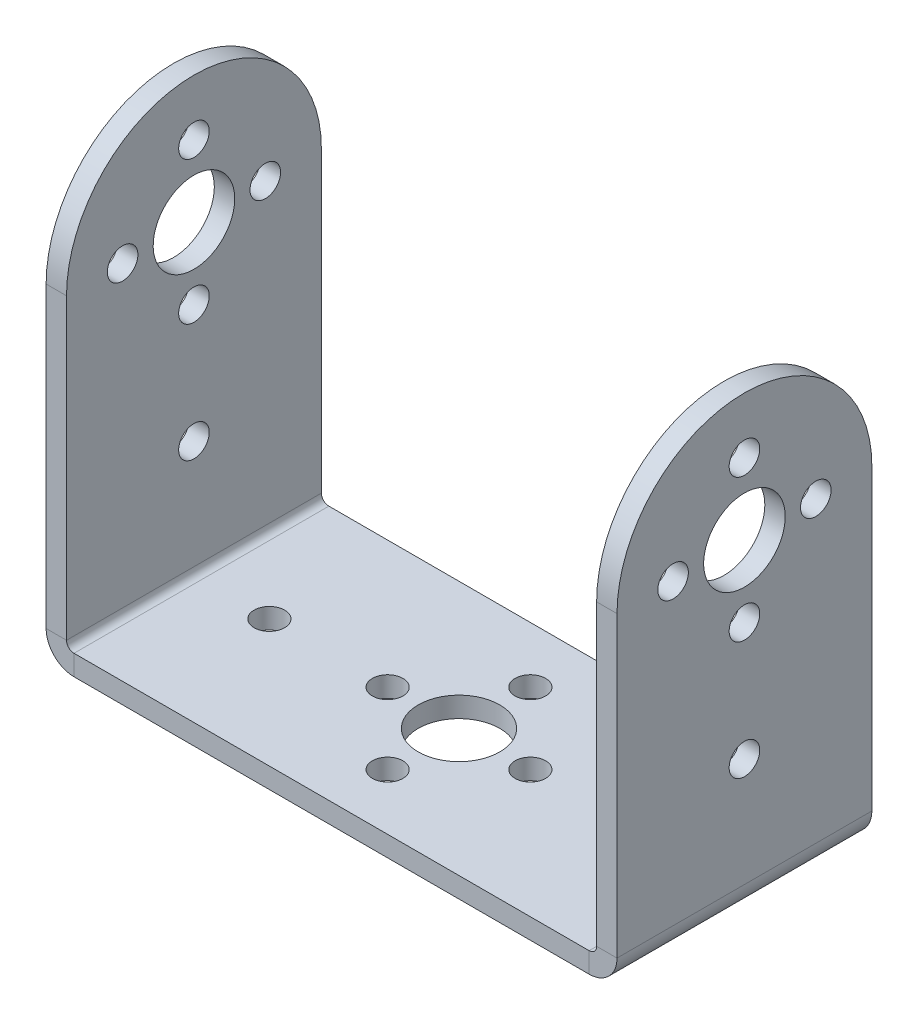
ISO-10303-21;
HEADER;
FILE_DESCRIPTION(('STEP AP214'),'2;1');
FILE_NAME('part.step','',(''),(''),'','','');
FILE_SCHEMA(('AUTOMOTIVE_DESIGN { 1 0 10303 214 1 1 1 1 }'));
ENDSEC;
DATA;
#1=APPLICATION_CONTEXT('core data for automotive mechanical design processes');
#2=APPLICATION_PROTOCOL_DEFINITION('international standard','automotive_design',2000,#1);
#3=PRODUCT_CONTEXT('',#1,'mechanical');
#4=PRODUCT('Part','Part','',(#3));
#5=PRODUCT_RELATED_PRODUCT_CATEGORY('part','',(#4));
#6=PRODUCT_DEFINITION_FORMATION('','',#4);
#7=PRODUCT_DEFINITION_CONTEXT('part definition',#1,'design');
#8=PRODUCT_DEFINITION('design','',#6,#7);
#9=PRODUCT_DEFINITION_SHAPE('','',#8);
#10=(LENGTH_UNIT() NAMED_UNIT(*) SI_UNIT(.MILLI.,.METRE.));
#11=(NAMED_UNIT(*) PLANE_ANGLE_UNIT() SI_UNIT($,.RADIAN.));
#12=(NAMED_UNIT(*) SI_UNIT($,.STERADIAN.) SOLID_ANGLE_UNIT());
#13=UNCERTAINTY_MEASURE_WITH_UNIT(LENGTH_MEASURE(1.E-05),#10,'distance_accuracy_value','');
#14=(GEOMETRIC_REPRESENTATION_CONTEXT(3) GLOBAL_UNCERTAINTY_ASSIGNED_CONTEXT((#13)) GLOBAL_UNIT_ASSIGNED_CONTEXT((#10,
#11,#12)) REPRESENTATION_CONTEXT('',''));
#15=CARTESIAN_POINT('',(0.,0.,0.));
#16=DIRECTION('',(0.,0.,1.));
#17=DIRECTION('',(1.,0.,0.));
#18=AXIS2_PLACEMENT_3D('',#15,#16,#17);
#19=CARTESIAN_POINT('',(0.,0.,0.));
#20=DIRECTION('',(0.,1.,0.));
#21=DIRECTION('',(0.,0.,1.));
#22=AXIS2_PLACEMENT_3D('',#19,#20,#21);
#23=PLANE('',#22);
#24=CARTESIAN_POINT('',(18.6,0.,0.));
#25=DIRECTION('',(0.,1.,0.));
#26=DIRECTION('',(0.,0.,1.));
#27=AXIS2_PLACEMENT_3D('',#24,#25,#26);
#28=CIRCLE('',#27,1.49999999999999);
#29=CARTESIAN_POINT('',(18.6,0.,1.49999999999999));
#30=VERTEX_POINT('',#29);
#31=EDGE_CURVE('E330',#30,#30,#28,.F.);
#32=ORIENTED_EDGE('',*,*,#31,.T.);
#33=EDGE_LOOP('',(#32));
#34=FACE_BOUND('',#33,.T.);
#35=DIRECTION('',(-1.,0.,0.));
#36=VECTOR('',#35,1.);
#37=CARTESIAN_POINT('',(-26.,0.,-12.5));
#38=LINE('',#37,#36);
#39=CARTESIAN_POINT('',(25.2634,0.,-12.5));
#40=VERTEX_POINT('',#39);
#41=CARTESIAN_POINT('',(-25.2634,0.,-12.5));
#42=VERTEX_POINT('',#41);
#43=EDGE_CURVE('E242',#40,#42,#38,.T.);
#44=ORIENTED_EDGE('',*,*,#43,.T.);
#45=DIRECTION('',(0.,0.,1.));
#46=VECTOR('',#45,1.);
#47=CARTESIAN_POINT('',(-25.2634,0.,12.5));
#48=LINE('',#47,#46);
#49=CARTESIAN_POINT('',(-25.2634,0.,12.5));
#50=VERTEX_POINT('',#49);
#51=EDGE_CURVE('E185',#50,#42,#48,.F.);
#52=ORIENTED_EDGE('',*,*,#51,.F.);
#53=DIRECTION('',(1.,0.,0.));
#54=VECTOR('',#53,1.);
#55=CARTESIAN_POINT('',(-26.,0.,12.5));
#56=LINE('',#55,#54);
#57=CARTESIAN_POINT('',(25.2634,0.,12.5));
#58=VERTEX_POINT('',#57);
#59=EDGE_CURVE('E246',#50,#58,#56,.T.);
#60=ORIENTED_EDGE('',*,*,#59,.T.);
#61=DIRECTION('',(0.,0.,-1.));
#62=VECTOR('',#61,1.);
#63=CARTESIAN_POINT('',(25.2634,0.,-12.5));
#64=LINE('',#63,#62);
#65=EDGE_CURVE('E53',#40,#58,#64,.F.);
#66=ORIENTED_EDGE('',*,*,#65,.F.);
#67=EDGE_LOOP('',(#44,#52,#60,#66));
#68=FACE_BOUND('',#67,.T.);
#69=CARTESIAN_POINT('',(-18.6,0.,0.));
#70=DIRECTION('',(0.,1.,0.));
#71=DIRECTION('',(0.,0.,1.));
#72=AXIS2_PLACEMENT_3D('',#69,#70,#71);
#73=CIRCLE('',#72,1.49999999999999);
#74=CARTESIAN_POINT('',(-18.6,0.,1.49999999999999));
#75=VERTEX_POINT('',#74);
#76=EDGE_CURVE('E324',#75,#75,#73,.F.);
#77=ORIENTED_EDGE('',*,*,#76,.T.);
#78=EDGE_LOOP('',(#77));
#79=FACE_BOUND('',#78,.T.);
#80=CARTESIAN_POINT('',(-7.,0.,0.));
#81=DIRECTION('',(0.,1.,0.));
#82=DIRECTION('',(0.,0.,1.));
#83=AXIS2_PLACEMENT_3D('',#80,#81,#82);
#84=CIRCLE('',#83,1.49999999999999);
#85=CARTESIAN_POINT('',(-7.,0.,1.49999999999999));
#86=VERTEX_POINT('',#85);
#87=EDGE_CURVE('E318',#86,#86,#84,.F.);
#88=ORIENTED_EDGE('',*,*,#87,.T.);
#89=EDGE_LOOP('',(#88));
#90=FACE_BOUND('',#89,.T.);
#91=CARTESIAN_POINT('',(7.,0.,0.));
#92=DIRECTION('',(0.,1.,0.));
#93=DIRECTION('',(0.,0.,1.));
#94=AXIS2_PLACEMENT_3D('',#91,#92,#93);
#95=CIRCLE('',#94,1.49999999999999);
#96=CARTESIAN_POINT('',(7.,0.,1.49999999999999));
#97=VERTEX_POINT('',#96);
#98=EDGE_CURVE('E312',#97,#97,#95,.F.);
#99=ORIENTED_EDGE('',*,*,#98,.T.);
#100=EDGE_LOOP('',(#99));
#101=FACE_BOUND('',#100,.T.);
#102=CARTESIAN_POINT('',(0.,0.,-7.));
#103=DIRECTION('',(0.,1.,0.));
#104=DIRECTION('',(0.,0.,1.));
#105=AXIS2_PLACEMENT_3D('',#102,#103,#104);
#106=CIRCLE('',#105,1.49999999999999);
#107=CARTESIAN_POINT('',(0.,0.,-5.50000000000001));
#108=VERTEX_POINT('',#107);
#109=EDGE_CURVE('E306',#108,#108,#106,.F.);
#110=ORIENTED_EDGE('',*,*,#109,.T.);
#111=EDGE_LOOP('',(#110));
#112=FACE_BOUND('',#111,.T.);
#113=CARTESIAN_POINT('',(0.,0.,7.));
#114=DIRECTION('',(0.,1.,0.));
#115=DIRECTION('',(0.,0.,1.));
#116=AXIS2_PLACEMENT_3D('',#113,#114,#115);
#117=CIRCLE('',#116,1.49999999999999);
#118=CARTESIAN_POINT('',(0.,0.,8.49999999999999));
#119=VERTEX_POINT('',#118);
#120=EDGE_CURVE('E300',#119,#119,#117,.F.);
#121=ORIENTED_EDGE('',*,*,#120,.T.);
#122=EDGE_LOOP('',(#121));
#123=FACE_BOUND('',#122,.T.);
#124=CARTESIAN_POINT('',(0.,0.,0.));
#125=DIRECTION('',(0.,1.,0.));
#126=DIRECTION('',(0.,0.,1.));
#127=AXIS2_PLACEMENT_3D('',#124,#125,#126);
#128=CIRCLE('',#127,4.);
#129=CARTESIAN_POINT('',(0.,0.,4.));
#130=VERTEX_POINT('',#129);
#131=EDGE_CURVE('E294',#130,#130,#128,.F.);
#132=ORIENTED_EDGE('',*,*,#131,.T.);
#133=EDGE_LOOP('',(#132));
#134=FACE_BOUND('',#133,.T.);
#135=ADVANCED_FACE('F36',(#34,#68,#79,#90,#101,#112,#123,#134),#23,.T.);
#136=CARTESIAN_POINT('',(0.,-2.,0.));
#137=DIRECTION('',(0.,1.,0.));
#138=DIRECTION('',(0.,0.,1.));
#139=AXIS2_PLACEMENT_3D('',#136,#137,#138);
#140=PLANE('',#139);
#141=CARTESIAN_POINT('',(0.,-2.,7.));
#142=DIRECTION('',(0.,-1.,0.));
#143=DIRECTION('',(0.,0.,-1.));
#144=AXIS2_PLACEMENT_3D('',#141,#142,#143);
#145=CIRCLE('',#144,1.49999999999999);
#146=CARTESIAN_POINT('',(0.,-2.,5.50000000000001));
#147=VERTEX_POINT('',#146);
#148=EDGE_CURVE('E297',#147,#147,#145,.T.);
#149=ORIENTED_EDGE('',*,*,#148,.F.);
#150=EDGE_LOOP('',(#149));
#151=FACE_BOUND('',#150,.T.);
#152=CARTESIAN_POINT('',(0.,-2.,-7.));
#153=DIRECTION('',(0.,-1.,0.));
#154=DIRECTION('',(0.,0.,-1.));
#155=AXIS2_PLACEMENT_3D('',#152,#153,#154);
#156=CIRCLE('',#155,1.49999999999999);
#157=CARTESIAN_POINT('',(0.,-2.,-8.49999999999999));
#158=VERTEX_POINT('',#157);
#159=EDGE_CURVE('E303',#158,#158,#156,.T.);
#160=ORIENTED_EDGE('',*,*,#159,.F.);
#161=EDGE_LOOP('',(#160));
#162=FACE_BOUND('',#161,.T.);
#163=CARTESIAN_POINT('',(7.,-2.,0.));
#164=DIRECTION('',(0.,-1.,0.));
#165=DIRECTION('',(0.,0.,-1.));
#166=AXIS2_PLACEMENT_3D('',#163,#164,#165);
#167=CIRCLE('',#166,1.49999999999999);
#168=CARTESIAN_POINT('',(7.,-2.,-1.49999999999999));
#169=VERTEX_POINT('',#168);
#170=EDGE_CURVE('E309',#169,#169,#167,.T.);
#171=ORIENTED_EDGE('',*,*,#170,.F.);
#172=EDGE_LOOP('',(#171));
#173=FACE_BOUND('',#172,.T.);
#174=CARTESIAN_POINT('',(-7.,-2.,0.));
#175=DIRECTION('',(0.,-1.,0.));
#176=DIRECTION('',(0.,0.,-1.));
#177=AXIS2_PLACEMENT_3D('',#174,#175,#176);
#178=CIRCLE('',#177,1.49999999999999);
#179=CARTESIAN_POINT('',(-7.,-2.,-1.49999999999999));
#180=VERTEX_POINT('',#179);
#181=EDGE_CURVE('E315',#180,#180,#178,.T.);
#182=ORIENTED_EDGE('',*,*,#181,.F.);
#183=EDGE_LOOP('',(#182));
#184=FACE_BOUND('',#183,.T.);
#185=CARTESIAN_POINT('',(-18.6,-2.,0.));
#186=DIRECTION('',(0.,-1.,0.));
#187=DIRECTION('',(0.,0.,-1.));
#188=AXIS2_PLACEMENT_3D('',#185,#186,#187);
#189=CIRCLE('',#188,1.49999999999999);
#190=CARTESIAN_POINT('',(-18.6,-2.,-1.49999999999999));
#191=VERTEX_POINT('',#190);
#192=EDGE_CURVE('E321',#191,#191,#189,.T.);
#193=ORIENTED_EDGE('',*,*,#192,.F.);
#194=EDGE_LOOP('',(#193));
#195=FACE_BOUND('',#194,.T.);
#196=CARTESIAN_POINT('',(18.6,-2.,0.));
#197=DIRECTION('',(0.,-1.,0.));
#198=DIRECTION('',(0.,0.,-1.));
#199=AXIS2_PLACEMENT_3D('',#196,#197,#198);
#200=CIRCLE('',#199,1.49999999999999);
#201=CARTESIAN_POINT('',(18.6,-2.,-1.49999999999999));
#202=VERTEX_POINT('',#201);
#203=EDGE_CURVE('E327',#202,#202,#200,.T.);
#204=ORIENTED_EDGE('',*,*,#203,.F.);
#205=EDGE_LOOP('',(#204));
#206=FACE_BOUND('',#205,.T.);
#207=DIRECTION('',(0.,0.,1.));
#208=VECTOR('',#207,1.);
#209=CARTESIAN_POINT('',(-25.2634,-2.,12.5));
#210=LINE('',#209,#208);
#211=CARTESIAN_POINT('',(-25.2634,-2.,12.5));
#212=VERTEX_POINT('',#211);
#213=CARTESIAN_POINT('',(-25.2634,-2.,-12.5));
#214=VERTEX_POINT('',#213);
#215=EDGE_CURVE('E134',#212,#214,#210,.F.);
#216=ORIENTED_EDGE('',*,*,#215,.T.);
#217=DIRECTION('',(-1.,0.,0.));
#218=VECTOR('',#217,1.);
#219=CARTESIAN_POINT('',(-26.,-2.,-12.5));
#220=LINE('',#219,#218);
#221=CARTESIAN_POINT('',(25.2634,-2.,-12.5));
#222=VERTEX_POINT('',#221);
#223=EDGE_CURVE('E45',#222,#214,#220,.T.);
#224=ORIENTED_EDGE('',*,*,#223,.F.);
#225=DIRECTION('',(0.,0.,-1.));
#226=VECTOR('',#225,1.);
#227=CARTESIAN_POINT('',(25.2634,-2.,-12.5));
#228=LINE('',#227,#226);
#229=CARTESIAN_POINT('',(25.2634,-2.,12.5));
#230=VERTEX_POINT('',#229);
#231=EDGE_CURVE('E224',#222,#230,#228,.F.);
#232=ORIENTED_EDGE('',*,*,#231,.T.);
#233=DIRECTION('',(1.,0.,0.));
#234=VECTOR('',#233,1.);
#235=CARTESIAN_POINT('',(-26.,-2.,12.5));
#236=LINE('',#235,#234);
#237=EDGE_CURVE('E11',#212,#230,#236,.T.);
#238=ORIENTED_EDGE('',*,*,#237,.F.);
#239=EDGE_LOOP('',(#216,#224,#232,#238));
#240=FACE_BOUND('',#239,.T.);
#241=CARTESIAN_POINT('',(0.,-2.,0.));
#242=DIRECTION('',(0.,-1.,0.));
#243=DIRECTION('',(0.,0.,-1.));
#244=AXIS2_PLACEMENT_3D('',#241,#242,#243);
#245=CIRCLE('',#244,4.);
#246=CARTESIAN_POINT('',(0.,-2.,-4.));
#247=VERTEX_POINT('',#246);
#248=EDGE_CURVE('E291',#247,#247,#245,.T.);
#249=ORIENTED_EDGE('',*,*,#248,.F.);
#250=EDGE_LOOP('',(#249));
#251=FACE_BOUND('',#250,.T.);
#252=ADVANCED_FACE('F367',(#151,#162,#173,#184,#195,#206,#240,#251),#140,.F.);
#253=CARTESIAN_POINT('',(-26.,-2.,12.5));
#254=DIRECTION('',(0.,0.,1.));
#255=DIRECTION('',(1.,0.,0.));
#256=AXIS2_PLACEMENT_3D('',#253,#254,#255);
#257=PLANE('',#256);
#258=ORIENTED_EDGE('',*,*,#59,.F.);
#259=DIRECTION('',(0.,-1.,0.));
#260=VECTOR('',#259,1.);
#261=CARTESIAN_POINT('',(-25.2634,0.,12.5));
#262=LINE('',#261,#260);
#263=EDGE_CURVE('E181',#50,#212,#262,.T.);
#264=ORIENTED_EDGE('',*,*,#263,.T.);
#265=ORIENTED_EDGE('',*,*,#237,.T.);
#266=DIRECTION('',(0.,-1.,0.));
#267=VECTOR('',#266,1.);
#268=CARTESIAN_POINT('',(25.2634,0.,12.5));
#269=LINE('',#268,#267);
#270=EDGE_CURVE('E239',#58,#230,#269,.T.);
#271=ORIENTED_EDGE('',*,*,#270,.F.);
#272=EDGE_LOOP('',(#258,#264,#265,#271));
#273=FACE_BOUND('',#272,.T.);
#274=ADVANCED_FACE('F374',(#273),#257,.T.);
#275=CARTESIAN_POINT('',(-26.,-2.,-12.5));
#276=DIRECTION('',(0.,0.,-1.));
#277=DIRECTION('',(-1.,0.,0.));
#278=AXIS2_PLACEMENT_3D('',#275,#276,#277);
#279=PLANE('',#278);
#280=DIRECTION('',(0.,-1.,0.));
#281=VECTOR('',#280,1.);
#282=CARTESIAN_POINT('',(-25.2634,0.,-12.5));
#283=LINE('',#282,#281);
#284=EDGE_CURVE('E189',#42,#214,#283,.T.);
#285=ORIENTED_EDGE('',*,*,#284,.F.);
#286=ORIENTED_EDGE('',*,*,#43,.F.);
#287=DIRECTION('',(0.,-1.,0.));
#288=VECTOR('',#287,1.);
#289=CARTESIAN_POINT('',(25.2634,0.,-12.5));
#290=LINE('',#289,#288);
#291=EDGE_CURVE('E230',#40,#222,#290,.T.);
#292=ORIENTED_EDGE('',*,*,#291,.T.);
#293=ORIENTED_EDGE('',*,*,#223,.T.);
#294=EDGE_LOOP('',(#285,#286,#292,#293));
#295=FACE_BOUND('',#294,.T.);
#296=ADVANCED_FACE('F38',(#295),#279,.T.);
#297=CARTESIAN_POINT('',(25.2634,0.7366,12.5));
#298=DIRECTION('',(0.,0.,1.));
#299=DIRECTION('',(1.,0.,0.));
#300=AXIS2_PLACEMENT_3D('',#297,#298,#299);
#301=PLANE('',#300);
#302=DIRECTION('',(1.,0.,0.));
#303=VECTOR('',#302,1.);
#304=CARTESIAN_POINT('',(26.,0.736599999999997,12.5));
#305=LINE('',#304,#303);
#306=CARTESIAN_POINT('',(26.,0.736599999999997,12.5));
#307=VERTEX_POINT('',#306);
#308=CARTESIAN_POINT('',(28.,0.73659999999999,12.5));
#309=VERTEX_POINT('',#308);
#310=EDGE_CURVE('E192',#307,#309,#305,.T.);
#311=ORIENTED_EDGE('',*,*,#310,.F.);
#312=CARTESIAN_POINT('',(25.2634,0.7366,12.5));
#313=DIRECTION('',(0.,0.,-1.));
#314=DIRECTION('',(-1.,0.,0.));
#315=AXIS2_PLACEMENT_3D('',#312,#313,#314);
#316=CIRCLE('',#315,0.7366);
#317=EDGE_CURVE('E233',#58,#307,#316,.F.);
#318=ORIENTED_EDGE('',*,*,#317,.F.);
#319=ORIENTED_EDGE('',*,*,#270,.T.);
#320=CARTESIAN_POINT('',(25.2634,0.7366,12.5));
#321=DIRECTION('',(0.,0.,-1.));
#322=DIRECTION('',(-1.,0.,0.));
#323=AXIS2_PLACEMENT_3D('',#320,#321,#322);
#324=CIRCLE('',#323,2.7366);
#325=EDGE_CURVE('E226',#230,#309,#324,.F.);
#326=ORIENTED_EDGE('',*,*,#325,.T.);
#327=EDGE_LOOP('',(#311,#318,#319,#326));
#328=FACE_BOUND('',#327,.T.);
#329=ADVANCED_FACE('F382',(#328),#301,.T.);
#330=CARTESIAN_POINT('',(25.2634,0.7366,-12.5));
#331=DIRECTION('',(0.,0.,1.));
#332=DIRECTION('',(1.,0.,0.));
#333=AXIS2_PLACEMENT_3D('',#330,#331,#332);
#334=PLANE('',#333);
#335=CARTESIAN_POINT('',(25.2634,0.7366,-12.5));
#336=DIRECTION('',(0.,0.,-1.));
#337=DIRECTION('',(-1.,0.,0.));
#338=AXIS2_PLACEMENT_3D('',#335,#336,#337);
#339=CIRCLE('',#338,0.7366);
#340=CARTESIAN_POINT('',(26.,0.736599999999997,-12.5));
#341=VERTEX_POINT('',#340);
#342=EDGE_CURVE('E223',#341,#40,#339,.T.);
#343=ORIENTED_EDGE('',*,*,#342,.F.);
#344=DIRECTION('',(1.,0.,0.));
#345=VECTOR('',#344,1.);
#346=CARTESIAN_POINT('',(26.,0.736599999999997,-12.5));
#347=LINE('',#346,#345);
#348=CARTESIAN_POINT('',(28.,0.73659999999999,-12.5));
#349=VERTEX_POINT('',#348);
#350=EDGE_CURVE('E196',#341,#349,#347,.T.);
#351=ORIENTED_EDGE('',*,*,#350,.T.);
#352=CARTESIAN_POINT('',(25.2634,0.7366,-12.5));
#353=DIRECTION('',(0.,0.,-1.));
#354=DIRECTION('',(-1.,0.,0.));
#355=AXIS2_PLACEMENT_3D('',#352,#353,#354);
#356=CIRCLE('',#355,2.7366);
#357=EDGE_CURVE('E227',#349,#222,#356,.T.);
#358=ORIENTED_EDGE('',*,*,#357,.T.);
#359=ORIENTED_EDGE('',*,*,#291,.F.);
#360=EDGE_LOOP('',(#343,#351,#358,#359));
#361=FACE_BOUND('',#360,.T.);
#362=ADVANCED_FACE('F390',(#361),#334,.F.);
#363=CARTESIAN_POINT('',(25.2634,0.7366,-12.5));
#364=DIRECTION('',(0.,0.,-1.));
#365=DIRECTION('',(1.,0.,0.));
#366=AXIS2_PLACEMENT_3D('',#363,#364,#365);
#367=CYLINDRICAL_SURFACE('',#366,2.7366);
#368=ORIENTED_EDGE('',*,*,#231,.F.);
#369=ORIENTED_EDGE('',*,*,#357,.F.);
#370=DIRECTION('',(0.,0.,1.));
#371=VECTOR('',#370,1.);
#372=CARTESIAN_POINT('',(28.,0.73659999999999,0.));
#373=LINE('',#372,#371);
#374=EDGE_CURVE('E199',#349,#309,#373,.T.);
#375=ORIENTED_EDGE('',*,*,#374,.T.);
#376=ORIENTED_EDGE('',*,*,#325,.F.);
#377=EDGE_LOOP('',(#368,#369,#375,#376));
#378=FACE_BOUND('',#377,.T.);
#379=ADVANCED_FACE('F417',(#378),#367,.T.);
#380=CARTESIAN_POINT('',(25.2634,0.7366,-12.5));
#381=DIRECTION('',(0.,0.,-1.));
#382=DIRECTION('',(1.,0.,0.));
#383=AXIS2_PLACEMENT_3D('',#380,#381,#382);
#384=CYLINDRICAL_SURFACE('',#383,0.7366);
#385=ORIENTED_EDGE('',*,*,#65,.T.);
#386=ORIENTED_EDGE('',*,*,#317,.T.);
#387=DIRECTION('',(0.,0.,-1.));
#388=VECTOR('',#387,1.);
#389=CARTESIAN_POINT('',(26.,0.736599999999997,12.5));
#390=LINE('',#389,#388);
#391=EDGE_CURVE('E194',#307,#341,#390,.T.);
#392=ORIENTED_EDGE('',*,*,#391,.T.);
#393=ORIENTED_EDGE('',*,*,#342,.T.);
#394=EDGE_LOOP('',(#385,#386,#392,#393));
#395=FACE_BOUND('',#394,.T.);
#396=ADVANCED_FACE('F393',(#395),#384,.F.);
#397=CARTESIAN_POINT('',(28.,0.,12.5));
#398=DIRECTION('',(0.,0.,-1.));
#399=DIRECTION('',(-1.,0.,0.));
#400=AXIS2_PLACEMENT_3D('',#397,#398,#399);
#401=PLANE('',#400);
#402=ORIENTED_EDGE('',*,*,#310,.T.);
#403=DIRECTION('',(0.,-1.,0.));
#404=VECTOR('',#403,1.);
#405=CARTESIAN_POINT('',(28.,0.,12.5));
#406=LINE('',#405,#404);
#407=CARTESIAN_POINT('',(28.0000000000001,30.,12.5));
#408=VERTEX_POINT('',#407);
#409=EDGE_CURVE('E204',#408,#309,#406,.T.);
#410=ORIENTED_EDGE('',*,*,#409,.F.);
#411=DIRECTION('',(-1.,0.,0.));
#412=VECTOR('',#411,1.);
#413=CARTESIAN_POINT('',(28.0000000000001,30.,12.5));
#414=LINE('',#413,#412);
#415=CARTESIAN_POINT('',(26.0000000000001,30.,12.5));
#416=VERTEX_POINT('',#415);
#417=EDGE_CURVE('E212',#408,#416,#414,.T.);
#418=ORIENTED_EDGE('',*,*,#417,.T.);
#419=DIRECTION('',(0.,-1.,0.));
#420=VECTOR('',#419,1.);
#421=CARTESIAN_POINT('',(26.,0.,12.5));
#422=LINE('',#421,#420);
#423=EDGE_CURVE('E203',#416,#307,#422,.T.);
#424=ORIENTED_EDGE('',*,*,#423,.T.);
#425=EDGE_LOOP('',(#402,#410,#418,#424));
#426=FACE_BOUND('',#425,.T.);
#427=ADVANCED_FACE('F402',(#426),#401,.F.);
#428=CARTESIAN_POINT('',(28.0000000000001,30.,-12.5));
#429=DIRECTION('',(0.,0.,1.));
#430=DIRECTION('',(1.,0.,0.));
#431=AXIS2_PLACEMENT_3D('',#428,#429,#430);
#432=PLANE('',#431);
#433=ORIENTED_EDGE('',*,*,#350,.F.);
#434=DIRECTION('',(0.,1.,0.));
#435=VECTOR('',#434,1.);
#436=CARTESIAN_POINT('',(26.0000000000001,30.,-12.5));
#437=LINE('',#436,#435);
#438=CARTESIAN_POINT('',(26.0000000000001,30.,-12.5));
#439=VERTEX_POINT('',#438);
#440=EDGE_CURVE('E215',#341,#439,#437,.T.);
#441=ORIENTED_EDGE('',*,*,#440,.T.);
#442=DIRECTION('',(-1.,0.,0.));
#443=VECTOR('',#442,1.);
#444=CARTESIAN_POINT('',(28.0000000000001,30.,-12.5));
#445=LINE('',#444,#443);
#446=CARTESIAN_POINT('',(28.0000000000001,30.,-12.5));
#447=VERTEX_POINT('',#446);
#448=EDGE_CURVE('E220',#447,#439,#445,.T.);
#449=ORIENTED_EDGE('',*,*,#448,.F.);
#450=DIRECTION('',(0.,1.,0.));
#451=VECTOR('',#450,1.);
#452=CARTESIAN_POINT('',(28.0000000000001,30.,-12.5));
#453=LINE('',#452,#451);
#454=EDGE_CURVE('E207',#349,#447,#453,.T.);
#455=ORIENTED_EDGE('',*,*,#454,.F.);
#456=EDGE_LOOP('',(#433,#441,#449,#455));
#457=FACE_BOUND('',#456,.T.);
#458=ADVANCED_FACE('F411',(#457),#432,.F.);
#459=CARTESIAN_POINT('',(28.0000000000001,30.,0.));
#460=DIRECTION('',(-1.,0.,0.));
#461=DIRECTION('',(0.,-1.,0.));
#462=AXIS2_PLACEMENT_3D('',#459,#460,#461);
#463=PLANE('',#462);
#464=CARTESIAN_POINT('',(28.0000000000001,29.9999999999999,0.));
#465=DIRECTION('',(1.,0.,0.));
#466=DIRECTION('',(0.,0.,-1.));
#467=AXIS2_PLACEMENT_3D('',#464,#465,#466);
#468=CIRCLE('',#467,4.);
#469=CARTESIAN_POINT('',(28.0000000000001,29.9999999999999,-4.));
#470=VERTEX_POINT('',#469);
#471=EDGE_CURVE('E522',#470,#470,#468,.T.);
#472=ORIENTED_EDGE('',*,*,#471,.F.);
#473=EDGE_LOOP('',(#472));
#474=FACE_BOUND('',#473,.T.);
#475=CARTESIAN_POINT('',(28.,11.3999999999999,0.));
#476=DIRECTION('',(1.,0.,0.));
#477=DIRECTION('',(0.,0.,-1.));
#478=AXIS2_PLACEMENT_3D('',#475,#476,#477);
#479=CIRCLE('',#478,1.5);
#480=CARTESIAN_POINT('',(28.,11.3999999999999,-1.5));
#481=VERTEX_POINT('',#480);
#482=EDGE_CURVE('E530',#481,#481,#479,.T.);
#483=ORIENTED_EDGE('',*,*,#482,.F.);
#484=EDGE_LOOP('',(#483));
#485=FACE_BOUND('',#484,.T.);
#486=CARTESIAN_POINT('',(28.0000000000001,36.9999999999999,0.));
#487=DIRECTION('',(1.,0.,0.));
#488=DIRECTION('',(0.,0.,-1.));
#489=AXIS2_PLACEMENT_3D('',#486,#487,#488);
#490=CIRCLE('',#489,1.5);
#491=CARTESIAN_POINT('',(28.0000000000001,36.9999999999999,-1.5));
#492=VERTEX_POINT('',#491);
#493=EDGE_CURVE('E542',#492,#492,#490,.T.);
#494=ORIENTED_EDGE('',*,*,#493,.F.);
#495=EDGE_LOOP('',(#494));
#496=FACE_BOUND('',#495,.T.);
#497=CARTESIAN_POINT('',(28.0000000000001,29.9999999999999,-7.));
#498=DIRECTION('',(1.,0.,0.));
#499=DIRECTION('',(0.,0.,-1.));
#500=AXIS2_PLACEMENT_3D('',#497,#498,#499);
#501=CIRCLE('',#500,1.5);
#502=CARTESIAN_POINT('',(28.0000000000001,29.9999999999999,-8.5));
#503=VERTEX_POINT('',#502);
#504=EDGE_CURVE('E264',#503,#503,#501,.T.);
#505=ORIENTED_EDGE('',*,*,#504,.F.);
#506=EDGE_LOOP('',(#505));
#507=FACE_BOUND('',#506,.T.);
#508=CARTESIAN_POINT('',(28.0000000000001,29.9999999999999,7.));
#509=DIRECTION('',(1.,0.,0.));
#510=DIRECTION('',(0.,0.,-1.));
#511=AXIS2_PLACEMENT_3D('',#508,#509,#510);
#512=CIRCLE('',#511,1.5);
#513=CARTESIAN_POINT('',(28.0000000000001,29.9999999999999,5.5));
#514=VERTEX_POINT('',#513);
#515=EDGE_CURVE('E261',#514,#514,#512,.T.);
#516=ORIENTED_EDGE('',*,*,#515,.F.);
#517=EDGE_LOOP('',(#516));
#518=FACE_BOUND('',#517,.T.);
#519=CARTESIAN_POINT('',(28.0000000000001,22.9999999999999,0.));
#520=DIRECTION('',(1.,0.,0.));
#521=DIRECTION('',(0.,0.,-1.));
#522=AXIS2_PLACEMENT_3D('',#519,#520,#521);
#523=CIRCLE('',#522,1.5);
#524=CARTESIAN_POINT('',(28.0000000000001,22.9999999999999,-1.5));
#525=VERTEX_POINT('',#524);
#526=EDGE_CURVE('E284',#525,#525,#523,.T.);
#527=ORIENTED_EDGE('',*,*,#526,.F.);
#528=EDGE_LOOP('',(#527));
#529=FACE_BOUND('',#528,.T.);
#530=ORIENTED_EDGE('',*,*,#374,.F.);
#531=ORIENTED_EDGE('',*,*,#454,.T.);
#532=CARTESIAN_POINT('',(28.0000000000001,30.,0.));
#533=DIRECTION('',(1.,0.,0.));
#534=DIRECTION('',(0.,-1.,0.));
#535=AXIS2_PLACEMENT_3D('',#532,#533,#534);
#536=CIRCLE('',#535,12.5);
#537=EDGE_CURVE('E210',#447,#408,#536,.T.);
#538=ORIENTED_EDGE('',*,*,#537,.T.);
#539=ORIENTED_EDGE('',*,*,#409,.T.);
#540=EDGE_LOOP('',(#530,#531,#538,#539));
#541=FACE_BOUND('',#540,.T.);
#542=ADVANCED_FACE('F414',(#474,#485,#496,#507,#518,#529,#541),#463,.F.);
#543=CARTESIAN_POINT('',(26.0000000000001,30.,0.));
#544=DIRECTION('',(-1.,0.,0.));
#545=DIRECTION('',(0.,-1.,0.));
#546=AXIS2_PLACEMENT_3D('',#543,#544,#545);
#547=PLANE('',#546);
#548=CARTESIAN_POINT('',(26.0000000000001,29.9999999999999,0.));
#549=DIRECTION('',(-1.,0.,0.));
#550=DIRECTION('',(0.,-1.,0.));
#551=AXIS2_PLACEMENT_3D('',#548,#549,#550);
#552=CIRCLE('',#551,4.);
#553=CARTESIAN_POINT('',(26.0000000000001,25.9999999999999,0.));
#554=VERTEX_POINT('',#553);
#555=EDGE_CURVE('E524',#554,#554,#552,.T.);
#556=ORIENTED_EDGE('',*,*,#555,.F.);
#557=EDGE_LOOP('',(#556));
#558=FACE_BOUND('',#557,.T.);
#559=CARTESIAN_POINT('',(26.,11.3999999999999,0.));
#560=DIRECTION('',(-1.,0.,0.));
#561=DIRECTION('',(0.,-1.,0.));
#562=AXIS2_PLACEMENT_3D('',#559,#560,#561);
#563=CIRCLE('',#562,1.5);
#564=CARTESIAN_POINT('',(26.,9.8999999999999,0.));
#565=VERTEX_POINT('',#564);
#566=EDGE_CURVE('E539',#565,#565,#563,.T.);
#567=ORIENTED_EDGE('',*,*,#566,.F.);
#568=EDGE_LOOP('',(#567));
#569=FACE_BOUND('',#568,.T.);
#570=CARTESIAN_POINT('',(26.0000000000001,36.9999999999999,0.));
#571=DIRECTION('',(-1.,0.,0.));
#572=DIRECTION('',(0.,-1.,0.));
#573=AXIS2_PLACEMENT_3D('',#570,#571,#572);
#574=CIRCLE('',#573,1.5);
#575=CARTESIAN_POINT('',(26.0000000000001,35.4999999999999,0.));
#576=VERTEX_POINT('',#575);
#577=EDGE_CURVE('E269',#576,#576,#574,.T.);
#578=ORIENTED_EDGE('',*,*,#577,.F.);
#579=EDGE_LOOP('',(#578));
#580=FACE_BOUND('',#579,.T.);
#581=CARTESIAN_POINT('',(26.0000000000001,29.9999999999999,-7.));
#582=DIRECTION('',(-1.,0.,0.));
#583=DIRECTION('',(0.,-1.,0.));
#584=AXIS2_PLACEMENT_3D('',#581,#582,#583);
#585=CIRCLE('',#584,1.49999999999999);
#586=CARTESIAN_POINT('',(26.0000000000001,28.4999999999999,-7.));
#587=VERTEX_POINT('',#586);
#588=EDGE_CURVE('E256',#587,#587,#585,.T.);
#589=ORIENTED_EDGE('',*,*,#588,.F.);
#590=EDGE_LOOP('',(#589));
#591=FACE_BOUND('',#590,.T.);
#592=CARTESIAN_POINT('',(26.0000000000001,29.9999999999999,7.));
#593=DIRECTION('',(-1.,0.,0.));
#594=DIRECTION('',(0.,-1.,0.));
#595=AXIS2_PLACEMENT_3D('',#592,#593,#594);
#596=CIRCLE('',#595,1.49999999999999);
#597=CARTESIAN_POINT('',(26.0000000000001,28.4999999999999,7.));
#598=VERTEX_POINT('',#597);
#599=EDGE_CURVE('E281',#598,#598,#596,.T.);
#600=ORIENTED_EDGE('',*,*,#599,.F.);
#601=EDGE_LOOP('',(#600));
#602=FACE_BOUND('',#601,.T.);
#603=CARTESIAN_POINT('',(26.0000000000001,22.9999999999999,0.));
#604=DIRECTION('',(-1.,0.,0.));
#605=DIRECTION('',(0.,-1.,0.));
#606=AXIS2_PLACEMENT_3D('',#603,#604,#605);
#607=CIRCLE('',#606,1.5);
#608=CARTESIAN_POINT('',(26.0000000000001,21.4999999999999,0.));
#609=VERTEX_POINT('',#608);
#610=EDGE_CURVE('E252',#609,#609,#607,.T.);
#611=ORIENTED_EDGE('',*,*,#610,.F.);
#612=EDGE_LOOP('',(#611));
#613=FACE_BOUND('',#612,.T.);
#614=ORIENTED_EDGE('',*,*,#440,.F.);
#615=ORIENTED_EDGE('',*,*,#391,.F.);
#616=ORIENTED_EDGE('',*,*,#423,.F.);
#617=CARTESIAN_POINT('',(26.0000000000001,30.,0.));
#618=DIRECTION('',(1.,0.,0.));
#619=DIRECTION('',(0.,-1.,0.));
#620=AXIS2_PLACEMENT_3D('',#617,#618,#619);
#621=CIRCLE('',#620,12.5);
#622=EDGE_CURVE('E208',#439,#416,#621,.T.);
#623=ORIENTED_EDGE('',*,*,#622,.F.);
#624=EDGE_LOOP('',(#614,#615,#616,#623));
#625=FACE_BOUND('',#624,.T.);
#626=ADVANCED_FACE('F399',(#558,#569,#580,#591,#602,#613,#625),#547,.T.);
#627=CARTESIAN_POINT('',(28.0000000000001,30.,0.));
#628=DIRECTION('',(-1.,0.,0.));
#629=DIRECTION('',(0.,-1.,0.));
#630=AXIS2_PLACEMENT_3D('',#627,#628,#629);
#631=CYLINDRICAL_SURFACE('',#630,12.5);
#632=ORIENTED_EDGE('',*,*,#622,.T.);
#633=ORIENTED_EDGE('',*,*,#417,.F.);
#634=ORIENTED_EDGE('',*,*,#537,.F.);
#635=ORIENTED_EDGE('',*,*,#448,.T.);
#636=EDGE_LOOP('',(#632,#633,#634,#635));
#637=FACE_BOUND('',#636,.T.);
#638=ADVANCED_FACE('F407',(#637),#631,.T.);
#639=CARTESIAN_POINT('',(-25.2634,0.7366,-12.5));
#640=DIRECTION('',(0.,0.,-1.));
#641=DIRECTION('',(-1.,0.,0.));
#642=AXIS2_PLACEMENT_3D('',#639,#640,#641);
#643=PLANE('',#642);
#644=DIRECTION('',(-1.,0.,0.));
#645=VECTOR('',#644,1.);
#646=CARTESIAN_POINT('',(-26.,0.736599999999997,-12.5));
#647=LINE('',#646,#645);
#648=CARTESIAN_POINT('',(-26.,0.736599999999997,-12.5));
#649=VERTEX_POINT('',#648);
#650=CARTESIAN_POINT('',(-28.,0.73659999999999,-12.5));
#651=VERTEX_POINT('',#650);
#652=EDGE_CURVE('E333',#649,#651,#647,.T.);
#653=ORIENTED_EDGE('',*,*,#652,.F.);
#654=CARTESIAN_POINT('',(-25.2634,0.7366,-12.5));
#655=DIRECTION('',(0.,0.,1.));
#656=DIRECTION('',(1.,0.,0.));
#657=AXIS2_PLACEMENT_3D('',#654,#655,#656);
#658=CIRCLE('',#657,0.7366);
#659=EDGE_CURVE('E137',#42,#649,#658,.F.);
#660=ORIENTED_EDGE('',*,*,#659,.F.);
#661=ORIENTED_EDGE('',*,*,#284,.T.);
#662=CARTESIAN_POINT('',(-25.2634,0.7366,-12.5));
#663=DIRECTION('',(0.,0.,1.));
#664=DIRECTION('',(1.,0.,0.));
#665=AXIS2_PLACEMENT_3D('',#662,#663,#664);
#666=CIRCLE('',#665,2.7366);
#667=EDGE_CURVE('E180',#214,#651,#666,.F.);
#668=ORIENTED_EDGE('',*,*,#667,.T.);
#669=EDGE_LOOP('',(#653,#660,#661,#668));
#670=FACE_BOUND('',#669,.T.);
#671=ADVANCED_FACE('F341',(#670),#643,.T.);
#672=CARTESIAN_POINT('',(-25.2634,0.7366,12.5));
#673=DIRECTION('',(0.,0.,-1.));
#674=DIRECTION('',(-1.,0.,0.));
#675=AXIS2_PLACEMENT_3D('',#672,#673,#674);
#676=PLANE('',#675);
#677=CARTESIAN_POINT('',(-25.2634,0.7366,12.5));
#678=DIRECTION('',(0.,0.,1.));
#679=DIRECTION('',(1.,0.,0.));
#680=AXIS2_PLACEMENT_3D('',#677,#678,#679);
#681=CIRCLE('',#680,0.7366);
#682=CARTESIAN_POINT('',(-26.,0.736599999999997,12.5));
#683=VERTEX_POINT('',#682);
#684=EDGE_CURVE('E144',#683,#50,#681,.T.);
#685=ORIENTED_EDGE('',*,*,#684,.F.);
#686=DIRECTION('',(-1.,0.,0.));
#687=VECTOR('',#686,1.);
#688=CARTESIAN_POINT('',(-26.,0.736599999999997,12.5));
#689=LINE('',#688,#687);
#690=CARTESIAN_POINT('',(-28.,0.73659999999999,12.5));
#691=VERTEX_POINT('',#690);
#692=EDGE_CURVE('E141',#683,#691,#689,.T.);
#693=ORIENTED_EDGE('',*,*,#692,.T.);
#694=CARTESIAN_POINT('',(-25.2634,0.7366,12.5));
#695=DIRECTION('',(0.,0.,1.));
#696=DIRECTION('',(1.,0.,0.));
#697=AXIS2_PLACEMENT_3D('',#694,#695,#696);
#698=CIRCLE('',#697,2.7366);
#699=EDGE_CURVE('E127',#691,#212,#698,.T.);
#700=ORIENTED_EDGE('',*,*,#699,.T.);
#701=ORIENTED_EDGE('',*,*,#263,.F.);
#702=EDGE_LOOP('',(#685,#693,#700,#701));
#703=FACE_BOUND('',#702,.T.);
#704=ADVANCED_FACE('F142',(#703),#676,.F.);
#705=CARTESIAN_POINT('',(-25.2634,0.7366,12.5));
#706=DIRECTION('',(0.,0.,1.));
#707=DIRECTION('',(-1.,0.,0.));
#708=AXIS2_PLACEMENT_3D('',#705,#706,#707);
#709=CYLINDRICAL_SURFACE('',#708,2.7366);
#710=ORIENTED_EDGE('',*,*,#215,.F.);
#711=ORIENTED_EDGE('',*,*,#699,.F.);
#712=DIRECTION('',(0.,0.,-1.));
#713=VECTOR('',#712,1.);
#714=CARTESIAN_POINT('',(-28.,0.73659999999999,0.));
#715=LINE('',#714,#713);
#716=EDGE_CURVE('E132',#691,#651,#715,.T.);
#717=ORIENTED_EDGE('',*,*,#716,.T.);
#718=ORIENTED_EDGE('',*,*,#667,.F.);
#719=EDGE_LOOP('',(#710,#711,#717,#718));
#720=FACE_BOUND('',#719,.T.);
#721=ADVANCED_FACE('F129',(#720),#709,.T.);
#722=CARTESIAN_POINT('',(-25.2634,0.7366,12.5));
#723=DIRECTION('',(0.,0.,1.));
#724=DIRECTION('',(-1.,0.,0.));
#725=AXIS2_PLACEMENT_3D('',#722,#723,#724);
#726=CYLINDRICAL_SURFACE('',#725,0.7366);
#727=ORIENTED_EDGE('',*,*,#51,.T.);
#728=ORIENTED_EDGE('',*,*,#659,.T.);
#729=DIRECTION('',(0.,0.,1.));
#730=VECTOR('',#729,1.);
#731=CARTESIAN_POINT('',(-26.,0.736599999999997,-12.5));
#732=LINE('',#731,#730);
#733=EDGE_CURVE('E149',#649,#683,#732,.T.);
#734=ORIENTED_EDGE('',*,*,#733,.T.);
#735=ORIENTED_EDGE('',*,*,#684,.T.);
#736=EDGE_LOOP('',(#727,#728,#734,#735));
#737=FACE_BOUND('',#736,.T.);
#738=ADVANCED_FACE('F344',(#737),#726,.F.);
#739=CARTESIAN_POINT('',(-28.,0.,12.5));
#740=DIRECTION('',(0.,0.,1.));
#741=DIRECTION('',(1.,0.,0.));
#742=AXIS2_PLACEMENT_3D('',#739,#740,#741);
#743=PLANE('',#742);
#744=DIRECTION('',(0.,-1.,0.));
#745=VECTOR('',#744,1.);
#746=CARTESIAN_POINT('',(-28.,0.,12.5));
#747=LINE('',#746,#745);
#748=CARTESIAN_POINT('',(-28.0000000000001,30.,12.5));
#749=VERTEX_POINT('',#748);
#750=EDGE_CURVE('E156',#749,#691,#747,.T.);
#751=ORIENTED_EDGE('',*,*,#750,.T.);
#752=ORIENTED_EDGE('',*,*,#692,.F.);
#753=DIRECTION('',(0.,-1.,0.));
#754=VECTOR('',#753,1.);
#755=CARTESIAN_POINT('',(-26.,0.,12.5));
#756=LINE('',#755,#754);
#757=CARTESIAN_POINT('',(-26.0000000000001,30.,12.5));
#758=VERTEX_POINT('',#757);
#759=EDGE_CURVE('E159',#758,#683,#756,.T.);
#760=ORIENTED_EDGE('',*,*,#759,.F.);
#761=DIRECTION('',(1.,0.,0.));
#762=VECTOR('',#761,1.);
#763=CARTESIAN_POINT('',(-28.0000000000001,30.,12.5));
#764=LINE('',#763,#762);
#765=EDGE_CURVE('E162',#749,#758,#764,.T.);
#766=ORIENTED_EDGE('',*,*,#765,.F.);
#767=EDGE_LOOP('',(#751,#752,#760,#766));
#768=FACE_BOUND('',#767,.T.);
#769=ADVANCED_FACE('F161',(#768),#743,.T.);
#770=CARTESIAN_POINT('',(-28.0000000000001,30.,-12.5));
#771=DIRECTION('',(0.,0.,-1.));
#772=DIRECTION('',(-1.,0.,0.));
#773=AXIS2_PLACEMENT_3D('',#770,#771,#772);
#774=PLANE('',#773);
#775=DIRECTION('',(0.,1.,0.));
#776=VECTOR('',#775,1.);
#777=CARTESIAN_POINT('',(-26.0000000000001,30.,-12.5));
#778=LINE('',#777,#776);
#779=CARTESIAN_POINT('',(-26.0000000000001,30.,-12.5));
#780=VERTEX_POINT('',#779);
#781=EDGE_CURVE('E164',#649,#780,#778,.T.);
#782=ORIENTED_EDGE('',*,*,#781,.F.);
#783=ORIENTED_EDGE('',*,*,#652,.T.);
#784=DIRECTION('',(0.,1.,0.));
#785=VECTOR('',#784,1.);
#786=CARTESIAN_POINT('',(-28.0000000000001,30.,-12.5));
#787=LINE('',#786,#785);
#788=CARTESIAN_POINT('',(-28.0000000000001,30.,-12.5));
#789=VERTEX_POINT('',#788);
#790=EDGE_CURVE('E158',#651,#789,#787,.T.);
#791=ORIENTED_EDGE('',*,*,#790,.T.);
#792=DIRECTION('',(1.,0.,0.));
#793=VECTOR('',#792,1.);
#794=CARTESIAN_POINT('',(-28.0000000000001,30.,-12.5));
#795=LINE('',#794,#793);
#796=EDGE_CURVE('E172',#789,#780,#795,.T.);
#797=ORIENTED_EDGE('',*,*,#796,.T.);
#798=EDGE_LOOP('',(#782,#783,#791,#797));
#799=FACE_BOUND('',#798,.T.);
#800=ADVANCED_FACE('F337',(#799),#774,.T.);
#801=CARTESIAN_POINT('',(-28.0000000000001,30.,0.));
#802=DIRECTION('',(1.,0.,0.));
#803=DIRECTION('',(0.,-1.,0.));
#804=AXIS2_PLACEMENT_3D('',#801,#802,#803);
#805=PLANE('',#804);
#806=CARTESIAN_POINT('',(-28.0000000000003,29.9999999999999,0.));
#807=DIRECTION('',(1.,0.,0.));
#808=DIRECTION('',(0.,0.,-1.));
#809=AXIS2_PLACEMENT_3D('',#806,#807,#808);
#810=CIRCLE('',#809,3.99999999999999);
#811=CARTESIAN_POINT('',(-28.0000000000003,29.9999999999999,-3.99999999999999));
#812=VERTEX_POINT('',#811);
#813=EDGE_CURVE('E521',#812,#812,#810,.T.);
#814=ORIENTED_EDGE('',*,*,#813,.T.);
#815=EDGE_LOOP('',(#814));
#816=FACE_BOUND('',#815,.T.);
#817=CARTESIAN_POINT('',(-28.0000000000002,11.3999999999999,0.));
#818=DIRECTION('',(1.,0.,0.));
#819=DIRECTION('',(0.,0.,-1.));
#820=AXIS2_PLACEMENT_3D('',#817,#818,#819);
#821=CIRCLE('',#820,1.49999999999999);
#822=CARTESIAN_POINT('',(-28.0000000000002,11.3999999999999,-1.49999999999999));
#823=VERTEX_POINT('',#822);
#824=EDGE_CURVE('E533',#823,#823,#821,.T.);
#825=ORIENTED_EDGE('',*,*,#824,.T.);
#826=EDGE_LOOP('',(#825));
#827=FACE_BOUND('',#826,.T.);
#828=CARTESIAN_POINT('',(-28.0000000000001,36.9999999999999,0.));
#829=DIRECTION('',(1.,0.,0.));
#830=DIRECTION('',(0.,0.,-1.));
#831=AXIS2_PLACEMENT_3D('',#828,#829,#830);
#832=CIRCLE('',#831,1.49999999999999);
#833=CARTESIAN_POINT('',(-28.0000000000001,36.9999999999999,-1.49999999999999));
#834=VERTEX_POINT('',#833);
#835=EDGE_CURVE('E545',#834,#834,#832,.T.);
#836=ORIENTED_EDGE('',*,*,#835,.T.);
#837=EDGE_LOOP('',(#836));
#838=FACE_BOUND('',#837,.T.);
#839=CARTESIAN_POINT('',(-28.0000000000001,29.9999999999999,-7.));
#840=DIRECTION('',(1.,0.,0.));
#841=DIRECTION('',(0.,0.,-1.));
#842=AXIS2_PLACEMENT_3D('',#839,#840,#841);
#843=CIRCLE('',#842,1.49999999999999);
#844=CARTESIAN_POINT('',(-28.0000000000001,29.9999999999999,-8.49999999999999));
#845=VERTEX_POINT('',#844);
#846=EDGE_CURVE('E257',#845,#845,#843,.T.);
#847=ORIENTED_EDGE('',*,*,#846,.T.);
#848=EDGE_LOOP('',(#847));
#849=FACE_BOUND('',#848,.T.);
#850=CARTESIAN_POINT('',(-28.0000000000001,29.9999999999999,7.));
#851=DIRECTION('',(1.,0.,0.));
#852=DIRECTION('',(0.,0.,-1.));
#853=AXIS2_PLACEMENT_3D('',#850,#851,#852);
#854=CIRCLE('',#853,1.49999999999999);
#855=CARTESIAN_POINT('',(-28.0000000000001,29.9999999999999,5.50000000000001));
#856=VERTEX_POINT('',#855);
#857=EDGE_CURVE('E275',#856,#856,#854,.T.);
#858=ORIENTED_EDGE('',*,*,#857,.T.);
#859=EDGE_LOOP('',(#858));
#860=FACE_BOUND('',#859,.T.);
#861=CARTESIAN_POINT('',(-28.0000000000002,22.9999999999999,0.));
#862=DIRECTION('',(1.,0.,0.));
#863=DIRECTION('',(0.,0.,-1.));
#864=AXIS2_PLACEMENT_3D('',#861,#862,#863);
#865=CIRCLE('',#864,1.49999999999999);
#866=CARTESIAN_POINT('',(-28.0000000000002,22.9999999999999,-1.49999999999999));
#867=VERTEX_POINT('',#866);
#868=EDGE_CURVE('E253',#867,#867,#865,.T.);
#869=ORIENTED_EDGE('',*,*,#868,.T.);
#870=EDGE_LOOP('',(#869));
#871=FACE_BOUND('',#870,.T.);
#872=ORIENTED_EDGE('',*,*,#716,.F.);
#873=ORIENTED_EDGE('',*,*,#750,.F.);
#874=CARTESIAN_POINT('',(-28.0000000000001,30.,0.));
#875=DIRECTION('',(1.,0.,0.));
#876=DIRECTION('',(0.,-1.,0.));
#877=AXIS2_PLACEMENT_3D('',#874,#875,#876);
#878=CIRCLE('',#877,12.5);
#879=EDGE_CURVE('E163',#789,#749,#878,.T.);
#880=ORIENTED_EDGE('',*,*,#879,.F.);
#881=ORIENTED_EDGE('',*,*,#790,.F.);
#882=EDGE_LOOP('',(#872,#873,#880,#881));
#883=FACE_BOUND('',#882,.T.);
#884=ADVANCED_FACE('F154',(#816,#827,#838,#849,#860,#871,#883),#805,.F.);
#885=CARTESIAN_POINT('',(-26.0000000000001,30.,0.));
#886=DIRECTION('',(1.,0.,0.));
#887=DIRECTION('',(0.,-1.,0.));
#888=AXIS2_PLACEMENT_3D('',#885,#886,#887);
#889=PLANE('',#888);
#890=CARTESIAN_POINT('',(-26.0000000000001,29.9999999999999,0.));
#891=DIRECTION('',(1.,0.,0.));
#892=DIRECTION('',(0.,1.,0.));
#893=AXIS2_PLACEMENT_3D('',#890,#891,#892);
#894=CIRCLE('',#893,4.);
#895=CARTESIAN_POINT('',(-26.0000000000001,33.9999999999999,0.));
#896=VERTEX_POINT('',#895);
#897=EDGE_CURVE('E40',#896,#896,#894,.T.);
#898=ORIENTED_EDGE('',*,*,#897,.F.);
#899=EDGE_LOOP('',(#898));
#900=FACE_BOUND('',#899,.T.);
#901=CARTESIAN_POINT('',(-26.,11.3999999999999,0.));
#902=DIRECTION('',(1.,0.,0.));
#903=DIRECTION('',(0.,1.,0.));
#904=AXIS2_PLACEMENT_3D('',#901,#902,#903);
#905=CIRCLE('',#904,1.5);
#906=CARTESIAN_POINT('',(-26.,12.8999999999999,0.));
#907=VERTEX_POINT('',#906);
#908=EDGE_CURVE('E536',#907,#907,#905,.T.);
#909=ORIENTED_EDGE('',*,*,#908,.F.);
#910=EDGE_LOOP('',(#909));
#911=FACE_BOUND('',#910,.T.);
#912=CARTESIAN_POINT('',(-26.0000000000001,36.9999999999999,0.));
#913=DIRECTION('',(1.,0.,0.));
#914=DIRECTION('',(0.,1.,0.));
#915=AXIS2_PLACEMENT_3D('',#912,#913,#914);
#916=CIRCLE('',#915,1.5);
#917=CARTESIAN_POINT('',(-26.0000000000001,38.4999999999999,0.));
#918=VERTEX_POINT('',#917);
#919=EDGE_CURVE('E548',#918,#918,#916,.T.);
#920=ORIENTED_EDGE('',*,*,#919,.F.);
#921=EDGE_LOOP('',(#920));
#922=FACE_BOUND('',#921,.T.);
#923=CARTESIAN_POINT('',(-26.0000000000001,29.9999999999999,-7.));
#924=DIRECTION('',(1.,0.,0.));
#925=DIRECTION('',(0.,1.,0.));
#926=AXIS2_PLACEMENT_3D('',#923,#924,#925);
#927=CIRCLE('',#926,1.49999999999999);
#928=CARTESIAN_POINT('',(-26.0000000000001,31.4999999999999,-7.));
#929=VERTEX_POINT('',#928);
#930=EDGE_CURVE('E254',#929,#929,#927,.T.);
#931=ORIENTED_EDGE('',*,*,#930,.F.);
#932=EDGE_LOOP('',(#931));
#933=FACE_BOUND('',#932,.T.);
#934=CARTESIAN_POINT('',(-26.0000000000001,29.9999999999999,7.));
#935=DIRECTION('',(1.,0.,0.));
#936=DIRECTION('',(0.,1.,0.));
#937=AXIS2_PLACEMENT_3D('',#934,#935,#936);
#938=CIRCLE('',#937,1.49999999999999);
#939=CARTESIAN_POINT('',(-26.0000000000001,31.4999999999999,7.));
#940=VERTEX_POINT('',#939);
#941=EDGE_CURVE('E278',#940,#940,#938,.T.);
#942=ORIENTED_EDGE('',*,*,#941,.F.);
#943=EDGE_LOOP('',(#942));
#944=FACE_BOUND('',#943,.T.);
#945=CARTESIAN_POINT('',(-26.0000000000001,22.9999999999999,0.));
#946=DIRECTION('',(1.,0.,0.));
#947=DIRECTION('',(0.,1.,0.));
#948=AXIS2_PLACEMENT_3D('',#945,#946,#947);
#949=CIRCLE('',#948,1.5);
#950=CARTESIAN_POINT('',(-26.0000000000001,24.4999999999999,0.));
#951=VERTEX_POINT('',#950);
#952=EDGE_CURVE('E250',#951,#951,#949,.T.);
#953=ORIENTED_EDGE('',*,*,#952,.F.);
#954=EDGE_LOOP('',(#953));
#955=FACE_BOUND('',#954,.T.);
#956=ORIENTED_EDGE('',*,*,#759,.T.);
#957=ORIENTED_EDGE('',*,*,#733,.F.);
#958=ORIENTED_EDGE('',*,*,#781,.T.);
#959=CARTESIAN_POINT('',(-26.0000000000001,30.,0.));
#960=DIRECTION('',(1.,0.,0.));
#961=DIRECTION('',(0.,-1.,0.));
#962=AXIS2_PLACEMENT_3D('',#959,#960,#961);
#963=CIRCLE('',#962,12.5);
#964=EDGE_CURVE('E167',#780,#758,#963,.T.);
#965=ORIENTED_EDGE('',*,*,#964,.T.);
#966=EDGE_LOOP('',(#956,#957,#958,#965));
#967=FACE_BOUND('',#966,.T.);
#968=ADVANCED_FACE('F346',(#900,#911,#922,#933,#944,#955,#967),#889,.T.);
#969=CARTESIAN_POINT('',(-28.0000000000001,30.,0.));
#970=DIRECTION('',(1.,0.,0.));
#971=DIRECTION('',(0.,1.,0.));
#972=AXIS2_PLACEMENT_3D('',#969,#970,#971);
#973=CYLINDRICAL_SURFACE('',#972,12.5);
#974=ORIENTED_EDGE('',*,*,#964,.F.);
#975=ORIENTED_EDGE('',*,*,#796,.F.);
#976=ORIENTED_EDGE('',*,*,#879,.T.);
#977=ORIENTED_EDGE('',*,*,#765,.T.);
#978=EDGE_LOOP('',(#974,#975,#976,#977));
#979=FACE_BOUND('',#978,.T.);
#980=ADVANCED_FACE('F349',(#979),#973,.T.);
#981=CARTESIAN_POINT('',(18.6,-2.,0.));
#982=DIRECTION('',(0.,-1.,0.));
#983=DIRECTION('',(0.,0.,-1.));
#984=AXIS2_PLACEMENT_3D('',#981,#982,#983);
#985=CYLINDRICAL_SURFACE('',#984,1.49999999999999);
#986=ORIENTED_EDGE('',*,*,#31,.F.);
#987=EDGE_LOOP('',(#986));
#988=FACE_BOUND('',#987,.T.);
#989=ORIENTED_EDGE('',*,*,#203,.T.);
#990=EDGE_LOOP('',(#989));
#991=FACE_BOUND('',#990,.T.);
#992=ADVANCED_FACE('F351',(#988,#991),#985,.F.);
#993=CARTESIAN_POINT('',(-18.6,-2.,0.));
#994=DIRECTION('',(0.,-1.,0.));
#995=DIRECTION('',(0.,0.,-1.));
#996=AXIS2_PLACEMENT_3D('',#993,#994,#995);
#997=CYLINDRICAL_SURFACE('',#996,1.49999999999999);
#998=ORIENTED_EDGE('',*,*,#76,.F.);
#999=EDGE_LOOP('',(#998));
#1000=FACE_BOUND('',#999,.T.);
#1001=ORIENTED_EDGE('',*,*,#192,.T.);
#1002=EDGE_LOOP('',(#1001));
#1003=FACE_BOUND('',#1002,.T.);
#1004=ADVANCED_FACE('F358',(#1000,#1003),#997,.F.);
#1005=CARTESIAN_POINT('',(-7.,-2.,0.));
#1006=DIRECTION('',(0.,-1.,0.));
#1007=DIRECTION('',(0.,0.,-1.));
#1008=AXIS2_PLACEMENT_3D('',#1005,#1006,#1007);
#1009=CYLINDRICAL_SURFACE('',#1008,1.49999999999999);
#1010=ORIENTED_EDGE('',*,*,#87,.F.);
#1011=EDGE_LOOP('',(#1010));
#1012=FACE_BOUND('',#1011,.T.);
#1013=ORIENTED_EDGE('',*,*,#181,.T.);
#1014=EDGE_LOOP('',(#1013));
#1015=FACE_BOUND('',#1014,.T.);
#1016=ADVANCED_FACE('F461',(#1012,#1015),#1009,.F.);
#1017=CARTESIAN_POINT('',(7.,-2.,0.));
#1018=DIRECTION('',(0.,-1.,0.));
#1019=DIRECTION('',(0.,0.,-1.));
#1020=AXIS2_PLACEMENT_3D('',#1017,#1018,#1019);
#1021=CYLINDRICAL_SURFACE('',#1020,1.49999999999999);
#1022=ORIENTED_EDGE('',*,*,#98,.F.);
#1023=EDGE_LOOP('',(#1022));
#1024=FACE_BOUND('',#1023,.T.);
#1025=ORIENTED_EDGE('',*,*,#170,.T.);
#1026=EDGE_LOOP('',(#1025));
#1027=FACE_BOUND('',#1026,.T.);
#1028=ADVANCED_FACE('F465',(#1024,#1027),#1021,.F.);
#1029=CARTESIAN_POINT('',(0.,-2.,-7.));
#1030=DIRECTION('',(0.,-1.,0.));
#1031=DIRECTION('',(0.,0.,-1.));
#1032=AXIS2_PLACEMENT_3D('',#1029,#1030,#1031);
#1033=CYLINDRICAL_SURFACE('',#1032,1.49999999999999);
#1034=ORIENTED_EDGE('',*,*,#109,.F.);
#1035=EDGE_LOOP('',(#1034));
#1036=FACE_BOUND('',#1035,.T.);
#1037=ORIENTED_EDGE('',*,*,#159,.T.);
#1038=EDGE_LOOP('',(#1037));
#1039=FACE_BOUND('',#1038,.T.);
#1040=ADVANCED_FACE('F469',(#1036,#1039),#1033,.F.);
#1041=CARTESIAN_POINT('',(0.,-2.,7.));
#1042=DIRECTION('',(0.,-1.,0.));
#1043=DIRECTION('',(0.,0.,-1.));
#1044=AXIS2_PLACEMENT_3D('',#1041,#1042,#1043);
#1045=CYLINDRICAL_SURFACE('',#1044,1.49999999999999);
#1046=ORIENTED_EDGE('',*,*,#120,.F.);
#1047=EDGE_LOOP('',(#1046));
#1048=FACE_BOUND('',#1047,.T.);
#1049=ORIENTED_EDGE('',*,*,#148,.T.);
#1050=EDGE_LOOP('',(#1049));
#1051=FACE_BOUND('',#1050,.T.);
#1052=ADVANCED_FACE('F473',(#1048,#1051),#1045,.F.);
#1053=CARTESIAN_POINT('',(0.,-2.,0.));
#1054=DIRECTION('',(0.,-1.,0.));
#1055=DIRECTION('',(0.,0.,-1.));
#1056=AXIS2_PLACEMENT_3D('',#1053,#1054,#1055);
#1057=CYLINDRICAL_SURFACE('',#1056,4.);
#1058=ORIENTED_EDGE('',*,*,#131,.F.);
#1059=EDGE_LOOP('',(#1058));
#1060=FACE_BOUND('',#1059,.T.);
#1061=ORIENTED_EDGE('',*,*,#248,.T.);
#1062=EDGE_LOOP('',(#1061));
#1063=FACE_BOUND('',#1062,.T.);
#1064=ADVANCED_FACE('F477',(#1060,#1063),#1057,.F.);
#1065=CARTESIAN_POINT('',(28.0000000000001,22.9999999999999,0.));
#1066=DIRECTION('',(1.,0.,0.));
#1067=DIRECTION('',(0.,0.,-1.));
#1068=AXIS2_PLACEMENT_3D('',#1065,#1066,#1067);
#1069=CYLINDRICAL_SURFACE('',#1068,1.5);
#1070=ORIENTED_EDGE('',*,*,#952,.T.);
#1071=EDGE_LOOP('',(#1070));
#1072=FACE_BOUND('',#1071,.T.);
#1073=ORIENTED_EDGE('',*,*,#868,.F.);
#1074=EDGE_LOOP('',(#1073));
#1075=FACE_BOUND('',#1074,.T.);
#1076=ADVANCED_FACE('F481',(#1072,#1075),#1069,.F.);
#1077=ORIENTED_EDGE('',*,*,#610,.T.);
#1078=EDGE_LOOP('',(#1077));
#1079=FACE_BOUND('',#1078,.T.);
#1080=ORIENTED_EDGE('',*,*,#526,.T.);
#1081=EDGE_LOOP('',(#1080));
#1082=FACE_BOUND('',#1081,.T.);
#1083=ADVANCED_FACE('F485',(#1079,#1082),#1069,.F.);
#1084=CARTESIAN_POINT('',(28.0000000000001,29.9999999999999,7.));
#1085=DIRECTION('',(1.,0.,0.));
#1086=DIRECTION('',(0.,0.,-1.));
#1087=AXIS2_PLACEMENT_3D('',#1084,#1085,#1086);
#1088=CYLINDRICAL_SURFACE('',#1087,1.49999999999999);
#1089=ORIENTED_EDGE('',*,*,#941,.T.);
#1090=EDGE_LOOP('',(#1089));
#1091=FACE_BOUND('',#1090,.T.);
#1092=ORIENTED_EDGE('',*,*,#857,.F.);
#1093=EDGE_LOOP('',(#1092));
#1094=FACE_BOUND('',#1093,.T.);
#1095=ADVANCED_FACE('F487',(#1091,#1094),#1088,.F.);
#1096=ORIENTED_EDGE('',*,*,#599,.T.);
#1097=EDGE_LOOP('',(#1096));
#1098=FACE_BOUND('',#1097,.T.);
#1099=ORIENTED_EDGE('',*,*,#515,.T.);
#1100=EDGE_LOOP('',(#1099));
#1101=FACE_BOUND('',#1100,.T.);
#1102=ADVANCED_FACE('F490',(#1098,#1101),#1088,.F.);
#1103=CARTESIAN_POINT('',(28.0000000000001,29.9999999999999,-7.));
#1104=DIRECTION('',(1.,0.,0.));
#1105=DIRECTION('',(0.,0.,-1.));
#1106=AXIS2_PLACEMENT_3D('',#1103,#1104,#1105);
#1107=CYLINDRICAL_SURFACE('',#1106,1.49999999999999);
#1108=ORIENTED_EDGE('',*,*,#930,.T.);
#1109=EDGE_LOOP('',(#1108));
#1110=FACE_BOUND('',#1109,.T.);
#1111=ORIENTED_EDGE('',*,*,#846,.F.);
#1112=EDGE_LOOP('',(#1111));
#1113=FACE_BOUND('',#1112,.T.);
#1114=ADVANCED_FACE('F492',(#1110,#1113),#1107,.F.);
#1115=ORIENTED_EDGE('',*,*,#588,.T.);
#1116=EDGE_LOOP('',(#1115));
#1117=FACE_BOUND('',#1116,.T.);
#1118=ORIENTED_EDGE('',*,*,#504,.T.);
#1119=EDGE_LOOP('',(#1118));
#1120=FACE_BOUND('',#1119,.T.);
#1121=ADVANCED_FACE('F495',(#1117,#1120),#1107,.F.);
#1122=CARTESIAN_POINT('',(28.0000000000001,36.9999999999999,0.));
#1123=DIRECTION('',(1.,0.,0.));
#1124=DIRECTION('',(0.,0.,-1.));
#1125=AXIS2_PLACEMENT_3D('',#1122,#1123,#1124);
#1126=CYLINDRICAL_SURFACE('',#1125,1.5);
#1127=ORIENTED_EDGE('',*,*,#919,.T.);
#1128=EDGE_LOOP('',(#1127));
#1129=FACE_BOUND('',#1128,.T.);
#1130=ORIENTED_EDGE('',*,*,#835,.F.);
#1131=EDGE_LOOP('',(#1130));
#1132=FACE_BOUND('',#1131,.T.);
#1133=ADVANCED_FACE('F496',(#1129,#1132),#1126,.F.);
#1134=ORIENTED_EDGE('',*,*,#577,.T.);
#1135=EDGE_LOOP('',(#1134));
#1136=FACE_BOUND('',#1135,.T.);
#1137=ORIENTED_EDGE('',*,*,#493,.T.);
#1138=EDGE_LOOP('',(#1137));
#1139=FACE_BOUND('',#1138,.T.);
#1140=ADVANCED_FACE('F499',(#1136,#1139),#1126,.F.);
#1141=CARTESIAN_POINT('',(28.,11.3999999999999,0.));
#1142=DIRECTION('',(1.,0.,0.));
#1143=DIRECTION('',(0.,0.,-1.));
#1144=AXIS2_PLACEMENT_3D('',#1141,#1142,#1143);
#1145=CYLINDRICAL_SURFACE('',#1144,1.5);
#1146=ORIENTED_EDGE('',*,*,#908,.T.);
#1147=EDGE_LOOP('',(#1146));
#1148=FACE_BOUND('',#1147,.T.);
#1149=ORIENTED_EDGE('',*,*,#824,.F.);
#1150=EDGE_LOOP('',(#1149));
#1151=FACE_BOUND('',#1150,.T.);
#1152=ADVANCED_FACE('F501',(#1148,#1151),#1145,.F.);
#1153=ORIENTED_EDGE('',*,*,#566,.T.);
#1154=EDGE_LOOP('',(#1153));
#1155=FACE_BOUND('',#1154,.T.);
#1156=ORIENTED_EDGE('',*,*,#482,.T.);
#1157=EDGE_LOOP('',(#1156));
#1158=FACE_BOUND('',#1157,.T.);
#1159=ADVANCED_FACE('F504',(#1155,#1158),#1145,.F.);
#1160=CARTESIAN_POINT('',(28.0000000000001,29.9999999999999,0.));
#1161=DIRECTION('',(1.,0.,0.));
#1162=DIRECTION('',(0.,0.,-1.));
#1163=AXIS2_PLACEMENT_3D('',#1160,#1161,#1162);
#1164=CYLINDRICAL_SURFACE('',#1163,4.);
#1165=ORIENTED_EDGE('',*,*,#897,.T.);
#1166=EDGE_LOOP('',(#1165));
#1167=FACE_BOUND('',#1166,.T.);
#1168=ORIENTED_EDGE('',*,*,#813,.F.);
#1169=EDGE_LOOP('',(#1168));
#1170=FACE_BOUND('',#1169,.T.);
#1171=ADVANCED_FACE('F506',(#1167,#1170),#1164,.F.);
#1172=ORIENTED_EDGE('',*,*,#555,.T.);
#1173=EDGE_LOOP('',(#1172));
#1174=FACE_BOUND('',#1173,.T.);
#1175=ORIENTED_EDGE('',*,*,#471,.T.);
#1176=EDGE_LOOP('',(#1175));
#1177=FACE_BOUND('',#1176,.T.);
#1178=ADVANCED_FACE('F508',(#1174,#1177),#1164,.F.);
#1179=CLOSED_SHELL('',(#135,#252,#274,#296,#329,#362,#379,#396,#427,#458,#542,#626,#638,#671,
#704,#721,#738,#769,#800,#884,#968,#980,#992,#1004,#1016,#1028,#1040,#1052,#1064,#1076,#1083,
#1095,#1102,#1114,#1121,#1133,#1140,#1152,#1159,#1171,#1178));
#1180=MANIFOLD_SOLID_BREP('B2',#1179);
#1181=ADVANCED_BREP_SHAPE_REPRESENTATION('',(#18,#1180),#14);
#1182=SHAPE_DEFINITION_REPRESENTATION(#9,#1181);
ENDSEC;
END-ISO-10303-21;
